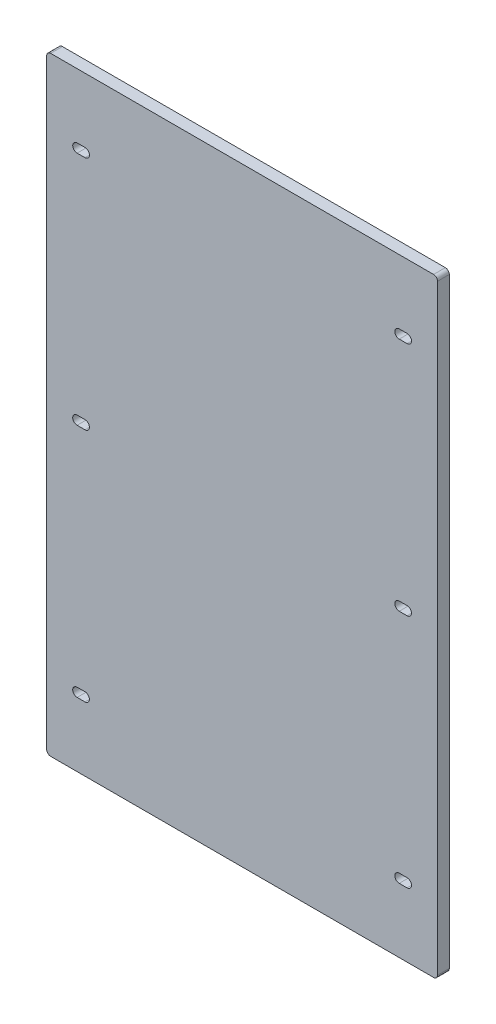
ISO-10303-21;
HEADER;
FILE_DESCRIPTION(('STEP AP214'),'2;1');
FILE_NAME('part.step','',(''),(''),'','','');
FILE_SCHEMA(('AUTOMOTIVE_DESIGN { 1 0 10303 214 1 1 1 1 }'));
ENDSEC;
DATA;
#1=APPLICATION_CONTEXT('core data for automotive mechanical design processes');
#2=APPLICATION_PROTOCOL_DEFINITION('international standard','automotive_design',2000,#1);
#3=PRODUCT_CONTEXT('',#1,'mechanical');
#4=PRODUCT('Part','Part','',(#3));
#5=PRODUCT_RELATED_PRODUCT_CATEGORY('part','',(#4));
#6=PRODUCT_DEFINITION_FORMATION('','',#4);
#7=PRODUCT_DEFINITION_CONTEXT('part definition',#1,'design');
#8=PRODUCT_DEFINITION('design','',#6,#7);
#9=PRODUCT_DEFINITION_SHAPE('','',#8);
#10=(LENGTH_UNIT() NAMED_UNIT(*) SI_UNIT(.MILLI.,.METRE.));
#11=(NAMED_UNIT(*) PLANE_ANGLE_UNIT() SI_UNIT($,.RADIAN.));
#12=(NAMED_UNIT(*) SI_UNIT($,.STERADIAN.) SOLID_ANGLE_UNIT());
#13=UNCERTAINTY_MEASURE_WITH_UNIT(LENGTH_MEASURE(1.E-05),#10,'distance_accuracy_value','');
#14=(GEOMETRIC_REPRESENTATION_CONTEXT(3) GLOBAL_UNCERTAINTY_ASSIGNED_CONTEXT((#13)) GLOBAL_UNIT_ASSIGNED_CONTEXT((#10,
#11,#12)) REPRESENTATION_CONTEXT('',''));
#15=CARTESIAN_POINT('',(0.,0.,0.));
#16=DIRECTION('',(0.,0.,1.));
#17=DIRECTION('',(1.,0.,0.));
#18=AXIS2_PLACEMENT_3D('',#15,#16,#17);
#19=CARTESIAN_POINT('',(0.,0.,-6.));
#20=DIRECTION('',(0.,0.,1.));
#21=DIRECTION('',(1.,0.,0.));
#22=AXIS2_PLACEMENT_3D('',#19,#20,#21);
#23=PLANE('',#22);
#24=CARTESIAN_POINT('',(84.,-120.,-6.));
#25=DIRECTION('',(0.,0.,1.));
#26=DIRECTION('',(1.,0.,0.));
#27=AXIS2_PLACEMENT_3D('',#24,#25,#26);
#28=CIRCLE('',#27,2.25);
#29=CARTESIAN_POINT('',(84.,-117.75,-6.));
#30=VERTEX_POINT('',#29);
#31=CARTESIAN_POINT('',(84.,-122.25,-6.));
#32=VERTEX_POINT('',#31);
#33=EDGE_CURVE('E316',#30,#32,#28,.F.);
#34=ORIENTED_EDGE('',*,*,#33,.F.);
#35=DIRECTION('',(1.,0.,0.));
#36=VECTOR('',#35,1.);
#37=CARTESIAN_POINT('',(0.,-117.75,-6.));
#38=LINE('',#37,#36);
#39=CARTESIAN_POINT('',(80.,-117.75,-6.));
#40=VERTEX_POINT('',#39);
#41=EDGE_CURVE('E303',#40,#30,#38,.T.);
#42=ORIENTED_EDGE('',*,*,#41,.F.);
#43=CARTESIAN_POINT('',(80.,-120.,-6.));
#44=DIRECTION('',(0.,0.,1.));
#45=DIRECTION('',(1.,0.,0.));
#46=AXIS2_PLACEMENT_3D('',#43,#44,#45);
#47=CIRCLE('',#46,2.25);
#48=CARTESIAN_POINT('',(80.,-122.25,-6.));
#49=VERTEX_POINT('',#48);
#50=EDGE_CURVE('E311',#49,#40,#47,.F.);
#51=ORIENTED_EDGE('',*,*,#50,.F.);
#52=DIRECTION('',(-1.,0.,0.));
#53=VECTOR('',#52,1.);
#54=CARTESIAN_POINT('',(0.,-122.25,-6.));
#55=LINE('',#54,#53);
#56=EDGE_CURVE('E314',#32,#49,#55,.T.);
#57=ORIENTED_EDGE('',*,*,#56,.F.);
#58=EDGE_LOOP('',(#34,#42,#51,#57));
#59=FACE_BOUND('',#58,.T.);
#60=DIRECTION('',(1.,0.,0.));
#61=VECTOR('',#60,1.);
#62=CARTESIAN_POINT('',(99.5,-155.,-6.));
#63=LINE('',#62,#61);
#64=CARTESIAN_POINT('',(-97.5,-155.,-6.));
#65=VERTEX_POINT('',#64);
#66=CARTESIAN_POINT('',(97.5,-155.,-6.));
#67=VERTEX_POINT('',#66);
#68=EDGE_CURVE('E448',#65,#67,#63,.T.);
#69=ORIENTED_EDGE('',*,*,#68,.F.);
#70=CARTESIAN_POINT('',(-97.5,-153.,-6.));
#71=DIRECTION('',(0.,0.,1.));
#72=DIRECTION('',(1.,0.,0.));
#73=AXIS2_PLACEMENT_3D('',#70,#71,#72);
#74=CIRCLE('',#73,2.);
#75=CARTESIAN_POINT('',(-99.5,-153.,-6.));
#76=VERTEX_POINT('',#75);
#77=EDGE_CURVE('E490',#65,#76,#74,.F.);
#78=ORIENTED_EDGE('',*,*,#77,.T.);
#79=DIRECTION('',(0.,-1.,0.));
#80=VECTOR('',#79,1.);
#81=CARTESIAN_POINT('',(-99.5,-155.,-6.));
#82=LINE('',#81,#80);
#83=CARTESIAN_POINT('',(-99.5,153.,-6.));
#84=VERTEX_POINT('',#83);
#85=EDGE_CURVE('E445',#84,#76,#82,.T.);
#86=ORIENTED_EDGE('',*,*,#85,.F.);
#87=CARTESIAN_POINT('',(-97.5,153.,-6.));
#88=DIRECTION('',(0.,0.,1.));
#89=DIRECTION('',(1.,0.,0.));
#90=AXIS2_PLACEMENT_3D('',#87,#88,#89);
#91=CIRCLE('',#90,2.);
#92=CARTESIAN_POINT('',(-97.5,155.,-6.));
#93=VERTEX_POINT('',#92);
#94=EDGE_CURVE('E485',#84,#93,#91,.F.);
#95=ORIENTED_EDGE('',*,*,#94,.T.);
#96=DIRECTION('',(-1.,0.,0.));
#97=VECTOR('',#96,1.);
#98=CARTESIAN_POINT('',(99.5,155.,-6.));
#99=LINE('',#98,#97);
#100=CARTESIAN_POINT('',(97.5,155.,-6.));
#101=VERTEX_POINT('',#100);
#102=EDGE_CURVE('E454',#101,#93,#99,.T.);
#103=ORIENTED_EDGE('',*,*,#102,.F.);
#104=CARTESIAN_POINT('',(97.5,153.,-6.));
#105=DIRECTION('',(0.,0.,1.));
#106=DIRECTION('',(1.,0.,0.));
#107=AXIS2_PLACEMENT_3D('',#104,#105,#106);
#108=CIRCLE('',#107,2.);
#109=CARTESIAN_POINT('',(99.5,153.,-6.));
#110=VERTEX_POINT('',#109);
#111=EDGE_CURVE('E52',#101,#110,#108,.F.);
#112=ORIENTED_EDGE('',*,*,#111,.T.);
#113=DIRECTION('',(0.,1.,0.));
#114=VECTOR('',#113,1.);
#115=CARTESIAN_POINT('',(99.5,-155.,-6.));
#116=LINE('',#115,#114);
#117=CARTESIAN_POINT('',(99.5,-153.,-6.));
#118=VERTEX_POINT('',#117);
#119=EDGE_CURVE('E452',#118,#110,#116,.T.);
#120=ORIENTED_EDGE('',*,*,#119,.F.);
#121=CARTESIAN_POINT('',(97.5,-153.,-6.));
#122=DIRECTION('',(0.,0.,1.));
#123=DIRECTION('',(1.,0.,0.));
#124=AXIS2_PLACEMENT_3D('',#121,#122,#123);
#125=CIRCLE('',#124,2.);
#126=EDGE_CURVE('E488',#118,#67,#125,.F.);
#127=ORIENTED_EDGE('',*,*,#126,.T.);
#128=EDGE_LOOP('',(#69,#78,#86,#95,#103,#112,#120,#127));
#129=FACE_BOUND('',#128,.T.);
#130=DIRECTION('',(-1.,0.,0.));
#131=VECTOR('',#130,1.);
#132=CARTESIAN_POINT('',(0.,2.25,-6.));
#133=LINE('',#132,#131);
#134=CARTESIAN_POINT('',(-80.,2.25,-6.));
#135=VERTEX_POINT('',#134);
#136=CARTESIAN_POINT('',(-84.,2.25,-6.));
#137=VERTEX_POINT('',#136);
#138=EDGE_CURVE('E438',#135,#137,#133,.T.);
#139=ORIENTED_EDGE('',*,*,#138,.T.);
#140=CARTESIAN_POINT('',(-84.,0.,-6.));
#141=DIRECTION('',(0.,0.,1.));
#142=DIRECTION('',(1.,0.,0.));
#143=AXIS2_PLACEMENT_3D('',#140,#141,#142);
#144=CIRCLE('',#143,2.25);
#145=CARTESIAN_POINT('',(-84.,-2.25,-6.));
#146=VERTEX_POINT('',#145);
#147=EDGE_CURVE('E441',#137,#146,#144,.T.);
#148=ORIENTED_EDGE('',*,*,#147,.T.);
#149=DIRECTION('',(1.,0.,0.));
#150=VECTOR('',#149,1.);
#151=CARTESIAN_POINT('',(0.,-2.25,-6.));
#152=LINE('',#151,#150);
#153=CARTESIAN_POINT('',(-80.,-2.25,-6.));
#154=VERTEX_POINT('',#153);
#155=EDGE_CURVE('E426',#146,#154,#152,.T.);
#156=ORIENTED_EDGE('',*,*,#155,.T.);
#157=CARTESIAN_POINT('',(-80.,0.,-6.));
#158=DIRECTION('',(0.,0.,1.));
#159=DIRECTION('',(1.,0.,0.));
#160=AXIS2_PLACEMENT_3D('',#157,#158,#159);
#161=CIRCLE('',#160,2.25);
#162=EDGE_CURVE('E435',#154,#135,#161,.T.);
#163=ORIENTED_EDGE('',*,*,#162,.T.);
#164=EDGE_LOOP('',(#139,#148,#156,#163));
#165=FACE_BOUND('',#164,.T.);
#166=DIRECTION('',(-1.,0.,0.));
#167=VECTOR('',#166,1.);
#168=CARTESIAN_POINT('',(0.,-117.75,-6.));
#169=LINE('',#168,#167);
#170=CARTESIAN_POINT('',(-80.,-117.75,-6.));
#171=VERTEX_POINT('',#170);
#172=CARTESIAN_POINT('',(-84.,-117.75,-6.));
#173=VERTEX_POINT('',#172);
#174=EDGE_CURVE('E406',#171,#173,#169,.T.);
#175=ORIENTED_EDGE('',*,*,#174,.T.);
#176=CARTESIAN_POINT('',(-84.,-120.,-6.));
#177=DIRECTION('',(0.,0.,1.));
#178=DIRECTION('',(1.,0.,0.));
#179=AXIS2_PLACEMENT_3D('',#176,#177,#178);
#180=CIRCLE('',#179,2.25);
#181=CARTESIAN_POINT('',(-84.,-122.25,-6.));
#182=VERTEX_POINT('',#181);
#183=EDGE_CURVE('E409',#173,#182,#180,.T.);
#184=ORIENTED_EDGE('',*,*,#183,.T.);
#185=DIRECTION('',(1.,0.,0.));
#186=VECTOR('',#185,1.);
#187=CARTESIAN_POINT('',(0.,-122.25,-6.));
#188=LINE('',#187,#186);
#189=CARTESIAN_POINT('',(-80.,-122.25,-6.));
#190=VERTEX_POINT('',#189);
#191=EDGE_CURVE('E394',#182,#190,#188,.T.);
#192=ORIENTED_EDGE('',*,*,#191,.T.);
#193=CARTESIAN_POINT('',(-80.,-120.,-6.));
#194=DIRECTION('',(0.,0.,1.));
#195=DIRECTION('',(1.,0.,0.));
#196=AXIS2_PLACEMENT_3D('',#193,#194,#195);
#197=CIRCLE('',#196,2.25);
#198=EDGE_CURVE('E403',#190,#171,#197,.T.);
#199=ORIENTED_EDGE('',*,*,#198,.T.);
#200=EDGE_LOOP('',(#175,#184,#192,#199));
#201=FACE_BOUND('',#200,.T.);
#202=DIRECTION('',(-1.,0.,0.));
#203=VECTOR('',#202,1.);
#204=CARTESIAN_POINT('',(0.,122.25,-6.));
#205=LINE('',#204,#203);
#206=CARTESIAN_POINT('',(-80.,122.25,-6.));
#207=VERTEX_POINT('',#206);
#208=CARTESIAN_POINT('',(-84.,122.25,-6.));
#209=VERTEX_POINT('',#208);
#210=EDGE_CURVE('E374',#207,#209,#205,.T.);
#211=ORIENTED_EDGE('',*,*,#210,.T.);
#212=CARTESIAN_POINT('',(-84.,120.,-6.));
#213=DIRECTION('',(0.,0.,1.));
#214=DIRECTION('',(1.,0.,0.));
#215=AXIS2_PLACEMENT_3D('',#212,#213,#214);
#216=CIRCLE('',#215,2.25);
#217=CARTESIAN_POINT('',(-84.,117.75,-6.));
#218=VERTEX_POINT('',#217);
#219=EDGE_CURVE('E377',#209,#218,#216,.T.);
#220=ORIENTED_EDGE('',*,*,#219,.T.);
#221=DIRECTION('',(1.,0.,0.));
#222=VECTOR('',#221,1.);
#223=CARTESIAN_POINT('',(0.,117.75,-6.));
#224=LINE('',#223,#222);
#225=CARTESIAN_POINT('',(-80.,117.75,-6.));
#226=VERTEX_POINT('',#225);
#227=EDGE_CURVE('E362',#218,#226,#224,.T.);
#228=ORIENTED_EDGE('',*,*,#227,.T.);
#229=CARTESIAN_POINT('',(-80.,120.,-6.));
#230=DIRECTION('',(0.,0.,1.));
#231=DIRECTION('',(1.,0.,0.));
#232=AXIS2_PLACEMENT_3D('',#229,#230,#231);
#233=CIRCLE('',#232,2.25);
#234=EDGE_CURVE('E371',#226,#207,#233,.T.);
#235=ORIENTED_EDGE('',*,*,#234,.T.);
#236=EDGE_LOOP('',(#211,#220,#228,#235));
#237=FACE_BOUND('',#236,.T.);
#238=CARTESIAN_POINT('',(84.,0.,-6.));
#239=DIRECTION('',(0.,0.,1.));
#240=DIRECTION('',(1.,0.,0.));
#241=AXIS2_PLACEMENT_3D('',#238,#239,#240);
#242=CIRCLE('',#241,2.25);
#243=CARTESIAN_POINT('',(84.,2.25,-6.));
#244=VERTEX_POINT('',#243);
#245=CARTESIAN_POINT('',(84.,-2.25,-6.));
#246=VERTEX_POINT('',#245);
#247=EDGE_CURVE('E346',#244,#246,#242,.F.);
#248=ORIENTED_EDGE('',*,*,#247,.F.);
#249=DIRECTION('',(1.,0.,0.));
#250=VECTOR('',#249,1.);
#251=CARTESIAN_POINT('',(0.,2.25,-6.));
#252=LINE('',#251,#250);
#253=CARTESIAN_POINT('',(80.,2.25,-6.));
#254=VERTEX_POINT('',#253);
#255=EDGE_CURVE('E333',#254,#244,#252,.T.);
#256=ORIENTED_EDGE('',*,*,#255,.F.);
#257=CARTESIAN_POINT('',(80.,0.,-6.));
#258=DIRECTION('',(0.,0.,1.));
#259=DIRECTION('',(1.,0.,0.));
#260=AXIS2_PLACEMENT_3D('',#257,#258,#259);
#261=CIRCLE('',#260,2.25);
#262=CARTESIAN_POINT('',(80.,-2.25,-6.));
#263=VERTEX_POINT('',#262);
#264=EDGE_CURVE('E341',#263,#254,#261,.F.);
#265=ORIENTED_EDGE('',*,*,#264,.F.);
#266=DIRECTION('',(-1.,0.,0.));
#267=VECTOR('',#266,1.);
#268=CARTESIAN_POINT('',(0.,-2.25,-6.));
#269=LINE('',#268,#267);
#270=EDGE_CURVE('E344',#246,#263,#269,.T.);
#271=ORIENTED_EDGE('',*,*,#270,.F.);
#272=EDGE_LOOP('',(#248,#256,#265,#271));
#273=FACE_BOUND('',#272,.T.);
#274=CARTESIAN_POINT('',(84.,120.,-6.));
#275=DIRECTION('',(0.,0.,1.));
#276=DIRECTION('',(1.,0.,0.));
#277=AXIS2_PLACEMENT_3D('',#274,#275,#276);
#278=CIRCLE('',#277,2.25);
#279=CARTESIAN_POINT('',(84.,122.25,-6.));
#280=VERTEX_POINT('',#279);
#281=CARTESIAN_POINT('',(84.,117.75,-6.));
#282=VERTEX_POINT('',#281);
#283=EDGE_CURVE('E286',#280,#282,#278,.F.);
#284=ORIENTED_EDGE('',*,*,#283,.F.);
#285=DIRECTION('',(1.,0.,0.));
#286=VECTOR('',#285,1.);
#287=CARTESIAN_POINT('',(0.,122.25,-6.));
#288=LINE('',#287,#286);
#289=CARTESIAN_POINT('',(80.,122.25,-6.));
#290=VERTEX_POINT('',#289);
#291=EDGE_CURVE('E279',#290,#280,#288,.T.);
#292=ORIENTED_EDGE('',*,*,#291,.F.);
#293=CARTESIAN_POINT('',(80.,120.,-6.));
#294=DIRECTION('',(0.,0.,1.));
#295=DIRECTION('',(1.,0.,0.));
#296=AXIS2_PLACEMENT_3D('',#293,#294,#295);
#297=CIRCLE('',#296,2.25);
#298=CARTESIAN_POINT('',(80.,117.75,-6.));
#299=VERTEX_POINT('',#298);
#300=EDGE_CURVE('E255',#299,#290,#297,.F.);
#301=ORIENTED_EDGE('',*,*,#300,.F.);
#302=DIRECTION('',(-1.,0.,0.));
#303=VECTOR('',#302,1.);
#304=CARTESIAN_POINT('',(0.,117.75,-6.));
#305=LINE('',#304,#303);
#306=EDGE_CURVE('E284',#282,#299,#305,.T.);
#307=ORIENTED_EDGE('',*,*,#306,.F.);
#308=EDGE_LOOP('',(#284,#292,#301,#307));
#309=FACE_BOUND('',#308,.T.);
#310=ADVANCED_FACE('F37',(#59,#129,#165,#201,#237,#273,#309),#23,.F.);
#311=CARTESIAN_POINT('',(0.,0.,0.));
#312=DIRECTION('',(0.,0.,1.));
#313=DIRECTION('',(1.,0.,0.));
#314=AXIS2_PLACEMENT_3D('',#311,#312,#313);
#315=PLANE('',#314);
#316=DIRECTION('',(1.,0.,0.));
#317=VECTOR('',#316,1.);
#318=CARTESIAN_POINT('',(84.,-117.75,0.));
#319=LINE('',#318,#317);
#320=CARTESIAN_POINT('',(80.,-117.75,0.));
#321=VERTEX_POINT('',#320);
#322=CARTESIAN_POINT('',(84.,-117.75,0.));
#323=VERTEX_POINT('',#322);
#324=EDGE_CURVE('E291',#321,#323,#319,.T.);
#325=ORIENTED_EDGE('',*,*,#324,.T.);
#326=CARTESIAN_POINT('',(84.,-120.,0.));
#327=DIRECTION('',(0.,0.,-1.));
#328=DIRECTION('',(-1.,0.,0.));
#329=AXIS2_PLACEMENT_3D('',#326,#327,#328);
#330=CIRCLE('',#329,2.25);
#331=CARTESIAN_POINT('',(84.,-122.25,0.));
#332=VERTEX_POINT('',#331);
#333=EDGE_CURVE('E288',#323,#332,#330,.T.);
#334=ORIENTED_EDGE('',*,*,#333,.T.);
#335=DIRECTION('',(-1.,0.,0.));
#336=VECTOR('',#335,1.);
#337=CARTESIAN_POINT('',(84.,-122.25,0.));
#338=LINE('',#337,#336);
#339=CARTESIAN_POINT('',(80.,-122.25,0.));
#340=VERTEX_POINT('',#339);
#341=EDGE_CURVE('E297',#332,#340,#338,.T.);
#342=ORIENTED_EDGE('',*,*,#341,.T.);
#343=CARTESIAN_POINT('',(80.,-120.,0.));
#344=DIRECTION('',(0.,0.,-1.));
#345=DIRECTION('',(-1.,0.,0.));
#346=AXIS2_PLACEMENT_3D('',#343,#344,#345);
#347=CIRCLE('',#346,2.25);
#348=EDGE_CURVE('E294',#340,#321,#347,.T.);
#349=ORIENTED_EDGE('',*,*,#348,.T.);
#350=EDGE_LOOP('',(#325,#334,#342,#349));
#351=FACE_BOUND('',#350,.T.);
#352=DIRECTION('',(0.,-1.,0.));
#353=VECTOR('',#352,1.);
#354=CARTESIAN_POINT('',(-99.5,-155.,0.));
#355=LINE('',#354,#353);
#356=CARTESIAN_POINT('',(-99.5,153.,0.));
#357=VERTEX_POINT('',#356);
#358=CARTESIAN_POINT('',(-99.5,-153.,0.));
#359=VERTEX_POINT('',#358);
#360=EDGE_CURVE('E444',#357,#359,#355,.T.);
#361=ORIENTED_EDGE('',*,*,#360,.T.);
#362=CARTESIAN_POINT('',(-97.5,-153.,0.));
#363=DIRECTION('',(0.,0.,1.));
#364=DIRECTION('',(1.,0.,0.));
#365=AXIS2_PLACEMENT_3D('',#362,#363,#364);
#366=CIRCLE('',#365,2.);
#367=CARTESIAN_POINT('',(-97.5,-155.,0.));
#368=VERTEX_POINT('',#367);
#369=EDGE_CURVE('E478',#359,#368,#366,.T.);
#370=ORIENTED_EDGE('',*,*,#369,.T.);
#371=DIRECTION('',(1.,0.,0.));
#372=VECTOR('',#371,1.);
#373=CARTESIAN_POINT('',(99.5,-155.,0.));
#374=LINE('',#373,#372);
#375=CARTESIAN_POINT('',(97.5,-155.,0.));
#376=VERTEX_POINT('',#375);
#377=EDGE_CURVE('E460',#368,#376,#374,.T.);
#378=ORIENTED_EDGE('',*,*,#377,.T.);
#379=CARTESIAN_POINT('',(97.5,-153.,0.));
#380=DIRECTION('',(0.,0.,1.));
#381=DIRECTION('',(1.,0.,0.));
#382=AXIS2_PLACEMENT_3D('',#379,#380,#381);
#383=CIRCLE('',#382,2.);
#384=CARTESIAN_POINT('',(99.5,-153.,0.));
#385=VERTEX_POINT('',#384);
#386=EDGE_CURVE('E476',#376,#385,#383,.T.);
#387=ORIENTED_EDGE('',*,*,#386,.T.);
#388=DIRECTION('',(0.,1.,0.));
#389=VECTOR('',#388,1.);
#390=CARTESIAN_POINT('',(99.5,-155.,0.));
#391=LINE('',#390,#389);
#392=CARTESIAN_POINT('',(99.5,153.,0.));
#393=VERTEX_POINT('',#392);
#394=EDGE_CURVE('E463',#385,#393,#391,.T.);
#395=ORIENTED_EDGE('',*,*,#394,.T.);
#396=CARTESIAN_POINT('',(97.5,153.,0.));
#397=DIRECTION('',(0.,0.,1.));
#398=DIRECTION('',(1.,0.,0.));
#399=AXIS2_PLACEMENT_3D('',#396,#397,#398);
#400=CIRCLE('',#399,2.);
#401=CARTESIAN_POINT('',(97.5,155.,0.));
#402=VERTEX_POINT('',#401);
#403=EDGE_CURVE('E474',#393,#402,#400,.T.);
#404=ORIENTED_EDGE('',*,*,#403,.T.);
#405=DIRECTION('',(-1.,0.,0.));
#406=VECTOR('',#405,1.);
#407=CARTESIAN_POINT('',(99.5,155.,0.));
#408=LINE('',#407,#406);
#409=CARTESIAN_POINT('',(-97.5,155.,0.));
#410=VERTEX_POINT('',#409);
#411=EDGE_CURVE('E449',#402,#410,#408,.T.);
#412=ORIENTED_EDGE('',*,*,#411,.T.);
#413=CARTESIAN_POINT('',(-97.5,153.,0.));
#414=DIRECTION('',(0.,0.,1.));
#415=DIRECTION('',(1.,0.,0.));
#416=AXIS2_PLACEMENT_3D('',#413,#414,#415);
#417=CIRCLE('',#416,2.);
#418=EDGE_CURVE('E472',#410,#357,#417,.T.);
#419=ORIENTED_EDGE('',*,*,#418,.T.);
#420=EDGE_LOOP('',(#361,#370,#378,#387,#395,#404,#412,#419));
#421=FACE_BOUND('',#420,.T.);
#422=CARTESIAN_POINT('',(-84.,0.,0.));
#423=DIRECTION('',(0.,0.,1.));
#424=DIRECTION('',(1.,0.,0.));
#425=AXIS2_PLACEMENT_3D('',#422,#423,#424);
#426=CIRCLE('',#425,2.25);
#427=CARTESIAN_POINT('',(-84.,2.25,0.));
#428=VERTEX_POINT('',#427);
#429=CARTESIAN_POINT('',(-84.,-2.25,0.));
#430=VERTEX_POINT('',#429);
#431=EDGE_CURVE('E412',#428,#430,#426,.T.);
#432=ORIENTED_EDGE('',*,*,#431,.F.);
#433=DIRECTION('',(-1.,0.,0.));
#434=VECTOR('',#433,1.);
#435=CARTESIAN_POINT('',(-84.,2.25,0.));
#436=LINE('',#435,#434);
#437=CARTESIAN_POINT('',(-80.,2.25,0.));
#438=VERTEX_POINT('',#437);
#439=EDGE_CURVE('E420',#438,#428,#436,.T.);
#440=ORIENTED_EDGE('',*,*,#439,.F.);
#441=CARTESIAN_POINT('',(-80.,0.,0.));
#442=DIRECTION('',(0.,0.,1.));
#443=DIRECTION('',(1.,0.,0.));
#444=AXIS2_PLACEMENT_3D('',#441,#442,#443);
#445=CIRCLE('',#444,2.25);
#446=CARTESIAN_POINT('',(-80.,-2.25,0.));
#447=VERTEX_POINT('',#446);
#448=EDGE_CURVE('E417',#447,#438,#445,.T.);
#449=ORIENTED_EDGE('',*,*,#448,.F.);
#450=DIRECTION('',(1.,0.,0.));
#451=VECTOR('',#450,1.);
#452=CARTESIAN_POINT('',(-84.,-2.25,0.));
#453=LINE('',#452,#451);
#454=EDGE_CURVE('E414',#430,#447,#453,.T.);
#455=ORIENTED_EDGE('',*,*,#454,.F.);
#456=EDGE_LOOP('',(#432,#440,#449,#455));
#457=FACE_BOUND('',#456,.T.);
#458=CARTESIAN_POINT('',(-84.,-120.,0.));
#459=DIRECTION('',(0.,0.,1.));
#460=DIRECTION('',(1.,0.,0.));
#461=AXIS2_PLACEMENT_3D('',#458,#459,#460);
#462=CIRCLE('',#461,2.25);
#463=CARTESIAN_POINT('',(-84.,-117.75,0.));
#464=VERTEX_POINT('',#463);
#465=CARTESIAN_POINT('',(-84.,-122.25,0.));
#466=VERTEX_POINT('',#465);
#467=EDGE_CURVE('E380',#464,#466,#462,.T.);
#468=ORIENTED_EDGE('',*,*,#467,.F.);
#469=DIRECTION('',(-1.,0.,0.));
#470=VECTOR('',#469,1.);
#471=CARTESIAN_POINT('',(-84.,-117.75,0.));
#472=LINE('',#471,#470);
#473=CARTESIAN_POINT('',(-80.,-117.75,0.));
#474=VERTEX_POINT('',#473);
#475=EDGE_CURVE('E388',#474,#464,#472,.T.);
#476=ORIENTED_EDGE('',*,*,#475,.F.);
#477=CARTESIAN_POINT('',(-80.,-120.,0.));
#478=DIRECTION('',(0.,0.,1.));
#479=DIRECTION('',(1.,0.,0.));
#480=AXIS2_PLACEMENT_3D('',#477,#478,#479);
#481=CIRCLE('',#480,2.25);
#482=CARTESIAN_POINT('',(-80.,-122.25,0.));
#483=VERTEX_POINT('',#482);
#484=EDGE_CURVE('E385',#483,#474,#481,.T.);
#485=ORIENTED_EDGE('',*,*,#484,.F.);
#486=DIRECTION('',(1.,0.,0.));
#487=VECTOR('',#486,1.);
#488=CARTESIAN_POINT('',(-84.,-122.25,0.));
#489=LINE('',#488,#487);
#490=EDGE_CURVE('E382',#466,#483,#489,.T.);
#491=ORIENTED_EDGE('',*,*,#490,.F.);
#492=EDGE_LOOP('',(#468,#476,#485,#491));
#493=FACE_BOUND('',#492,.T.);
#494=CARTESIAN_POINT('',(-84.,120.,0.));
#495=DIRECTION('',(0.,0.,1.));
#496=DIRECTION('',(1.,0.,0.));
#497=AXIS2_PLACEMENT_3D('',#494,#495,#496);
#498=CIRCLE('',#497,2.25);
#499=CARTESIAN_POINT('',(-84.,122.25,0.));
#500=VERTEX_POINT('',#499);
#501=CARTESIAN_POINT('',(-84.,117.75,0.));
#502=VERTEX_POINT('',#501);
#503=EDGE_CURVE('E348',#500,#502,#498,.T.);
#504=ORIENTED_EDGE('',*,*,#503,.F.);
#505=DIRECTION('',(-1.,0.,0.));
#506=VECTOR('',#505,1.);
#507=CARTESIAN_POINT('',(-84.,122.25,0.));
#508=LINE('',#507,#506);
#509=CARTESIAN_POINT('',(-80.,122.25,0.));
#510=VERTEX_POINT('',#509);
#511=EDGE_CURVE('E356',#510,#500,#508,.T.);
#512=ORIENTED_EDGE('',*,*,#511,.F.);
#513=CARTESIAN_POINT('',(-80.,120.,0.));
#514=DIRECTION('',(0.,0.,1.));
#515=DIRECTION('',(1.,0.,0.));
#516=AXIS2_PLACEMENT_3D('',#513,#514,#515);
#517=CIRCLE('',#516,2.25);
#518=CARTESIAN_POINT('',(-80.,117.75,0.));
#519=VERTEX_POINT('',#518);
#520=EDGE_CURVE('E353',#519,#510,#517,.T.);
#521=ORIENTED_EDGE('',*,*,#520,.F.);
#522=DIRECTION('',(1.,0.,0.));
#523=VECTOR('',#522,1.);
#524=CARTESIAN_POINT('',(-84.,117.75,0.));
#525=LINE('',#524,#523);
#526=EDGE_CURVE('E350',#502,#519,#525,.T.);
#527=ORIENTED_EDGE('',*,*,#526,.F.);
#528=EDGE_LOOP('',(#504,#512,#521,#527));
#529=FACE_BOUND('',#528,.T.);
#530=DIRECTION('',(1.,0.,0.));
#531=VECTOR('',#530,1.);
#532=CARTESIAN_POINT('',(84.,2.25,0.));
#533=LINE('',#532,#531);
#534=CARTESIAN_POINT('',(80.,2.25,0.));
#535=VERTEX_POINT('',#534);
#536=CARTESIAN_POINT('',(84.,2.25,0.));
#537=VERTEX_POINT('',#536);
#538=EDGE_CURVE('E321',#535,#537,#533,.T.);
#539=ORIENTED_EDGE('',*,*,#538,.T.);
#540=CARTESIAN_POINT('',(84.,0.,0.));
#541=DIRECTION('',(0.,0.,-1.));
#542=DIRECTION('',(-1.,0.,0.));
#543=AXIS2_PLACEMENT_3D('',#540,#541,#542);
#544=CIRCLE('',#543,2.25);
#545=CARTESIAN_POINT('',(84.,-2.25,0.));
#546=VERTEX_POINT('',#545);
#547=EDGE_CURVE('E318',#537,#546,#544,.T.);
#548=ORIENTED_EDGE('',*,*,#547,.T.);
#549=DIRECTION('',(-1.,0.,0.));
#550=VECTOR('',#549,1.);
#551=CARTESIAN_POINT('',(84.,-2.25,0.));
#552=LINE('',#551,#550);
#553=CARTESIAN_POINT('',(80.,-2.25,0.));
#554=VERTEX_POINT('',#553);
#555=EDGE_CURVE('E327',#546,#554,#552,.T.);
#556=ORIENTED_EDGE('',*,*,#555,.T.);
#557=CARTESIAN_POINT('',(80.,0.,0.));
#558=DIRECTION('',(0.,0.,-1.));
#559=DIRECTION('',(-1.,0.,0.));
#560=AXIS2_PLACEMENT_3D('',#557,#558,#559);
#561=CIRCLE('',#560,2.25);
#562=EDGE_CURVE('E324',#554,#535,#561,.T.);
#563=ORIENTED_EDGE('',*,*,#562,.T.);
#564=EDGE_LOOP('',(#539,#548,#556,#563));
#565=FACE_BOUND('',#564,.T.);
#566=DIRECTION('',(1.,0.,0.));
#567=VECTOR('',#566,1.);
#568=CARTESIAN_POINT('',(84.,122.25,0.));
#569=LINE('',#568,#567);
#570=CARTESIAN_POINT('',(80.,122.25,0.));
#571=VERTEX_POINT('',#570);
#572=CARTESIAN_POINT('',(84.,122.25,0.));
#573=VERTEX_POINT('',#572);
#574=EDGE_CURVE('E263',#571,#573,#569,.T.);
#575=ORIENTED_EDGE('',*,*,#574,.T.);
#576=CARTESIAN_POINT('',(84.,120.,0.));
#577=DIRECTION('',(0.,0.,-1.));
#578=DIRECTION('',(-1.,0.,0.));
#579=AXIS2_PLACEMENT_3D('',#576,#577,#578);
#580=CIRCLE('',#579,2.25);
#581=CARTESIAN_POINT('',(84.,117.75,0.));
#582=VERTEX_POINT('',#581);
#583=EDGE_CURVE('E268',#573,#582,#580,.T.);
#584=ORIENTED_EDGE('',*,*,#583,.T.);
#585=DIRECTION('',(-1.,0.,0.));
#586=VECTOR('',#585,1.);
#587=CARTESIAN_POINT('',(84.,117.75,0.));
#588=LINE('',#587,#586);
#589=CARTESIAN_POINT('',(80.,117.75,0.));
#590=VERTEX_POINT('',#589);
#591=EDGE_CURVE('E272',#582,#590,#588,.T.);
#592=ORIENTED_EDGE('',*,*,#591,.T.);
#593=CARTESIAN_POINT('',(80.,120.,0.));
#594=DIRECTION('',(0.,0.,-1.));
#595=DIRECTION('',(-1.,0.,0.));
#596=AXIS2_PLACEMENT_3D('',#593,#594,#595);
#597=CIRCLE('',#596,2.25);
#598=EDGE_CURVE('E252',#590,#571,#597,.T.);
#599=ORIENTED_EDGE('',*,*,#598,.T.);
#600=EDGE_LOOP('',(#575,#584,#592,#599));
#601=FACE_BOUND('',#600,.T.);
#602=ADVANCED_FACE('F270',(#351,#421,#457,#493,#529,#565,#601),#315,.T.);
#603=CARTESIAN_POINT('',(-99.5,-155.,-6.));
#604=DIRECTION('',(-1.,0.,0.));
#605=DIRECTION('',(0.,0.,1.));
#606=AXIS2_PLACEMENT_3D('',#603,#604,#605);
#607=PLANE('',#606);
#608=ORIENTED_EDGE('',*,*,#85,.T.);
#609=DIRECTION('',(0.,0.,1.));
#610=VECTOR('',#609,1.);
#611=CARTESIAN_POINT('',(-99.5,-153.,-6.));
#612=LINE('',#611,#610);
#613=EDGE_CURVE('E469',#76,#359,#612,.T.);
#614=ORIENTED_EDGE('',*,*,#613,.T.);
#615=ORIENTED_EDGE('',*,*,#360,.F.);
#616=DIRECTION('',(0.,0.,1.));
#617=VECTOR('',#616,1.);
#618=CARTESIAN_POINT('',(-99.5,153.,-6.));
#619=LINE('',#618,#617);
#620=EDGE_CURVE('E457',#357,#84,#619,.F.);
#621=ORIENTED_EDGE('',*,*,#620,.T.);
#622=EDGE_LOOP('',(#608,#614,#615,#621));
#623=FACE_BOUND('',#622,.T.);
#624=ADVANCED_FACE('F525',(#623),#607,.T.);
#625=CARTESIAN_POINT('',(99.5,155.,-6.));
#626=DIRECTION('',(0.,1.,0.));
#627=DIRECTION('',(0.,0.,1.));
#628=AXIS2_PLACEMENT_3D('',#625,#626,#627);
#629=PLANE('',#628);
#630=ORIENTED_EDGE('',*,*,#411,.F.);
#631=DIRECTION('',(0.,0.,1.));
#632=VECTOR('',#631,1.);
#633=CARTESIAN_POINT('',(97.5,155.,-6.));
#634=LINE('',#633,#632);
#635=EDGE_CURVE('E11',#402,#101,#634,.F.);
#636=ORIENTED_EDGE('',*,*,#635,.T.);
#637=ORIENTED_EDGE('',*,*,#102,.T.);
#638=DIRECTION('',(0.,0.,1.));
#639=VECTOR('',#638,1.);
#640=CARTESIAN_POINT('',(-97.5,155.,-6.));
#641=LINE('',#640,#639);
#642=EDGE_CURVE('E45',#93,#410,#641,.T.);
#643=ORIENTED_EDGE('',*,*,#642,.T.);
#644=EDGE_LOOP('',(#630,#636,#637,#643));
#645=FACE_BOUND('',#644,.T.);
#646=ADVANCED_FACE('F499',(#645),#629,.T.);
#647=CARTESIAN_POINT('',(99.5,-155.,-6.));
#648=DIRECTION('',(1.,0.,0.));
#649=DIRECTION('',(0.,0.,-1.));
#650=AXIS2_PLACEMENT_3D('',#647,#648,#649);
#651=PLANE('',#650);
#652=ORIENTED_EDGE('',*,*,#394,.F.);
#653=DIRECTION('',(0.,0.,1.));
#654=VECTOR('',#653,1.);
#655=CARTESIAN_POINT('',(99.5,-153.,-6.));
#656=LINE('',#655,#654);
#657=EDGE_CURVE('E59',#385,#118,#656,.F.);
#658=ORIENTED_EDGE('',*,*,#657,.T.);
#659=ORIENTED_EDGE('',*,*,#119,.T.);
#660=DIRECTION('',(0.,0.,1.));
#661=VECTOR('',#660,1.);
#662=CARTESIAN_POINT('',(99.5,153.,-6.));
#663=LINE('',#662,#661);
#664=EDGE_CURVE('E492',#110,#393,#663,.T.);
#665=ORIENTED_EDGE('',*,*,#664,.T.);
#666=EDGE_LOOP('',(#652,#658,#659,#665));
#667=FACE_BOUND('',#666,.T.);
#668=ADVANCED_FACE('F509',(#667),#651,.T.);
#669=CARTESIAN_POINT('',(99.5,-155.,-6.));
#670=DIRECTION('',(0.,-1.,0.));
#671=DIRECTION('',(0.,0.,-1.));
#672=AXIS2_PLACEMENT_3D('',#669,#670,#671);
#673=PLANE('',#672);
#674=ORIENTED_EDGE('',*,*,#377,.F.);
#675=DIRECTION('',(0.,0.,1.));
#676=VECTOR('',#675,1.);
#677=CARTESIAN_POINT('',(-97.5,-155.,-6.));
#678=LINE('',#677,#676);
#679=EDGE_CURVE('E483',#368,#65,#678,.F.);
#680=ORIENTED_EDGE('',*,*,#679,.T.);
#681=ORIENTED_EDGE('',*,*,#68,.T.);
#682=DIRECTION('',(0.,0.,1.));
#683=VECTOR('',#682,1.);
#684=CARTESIAN_POINT('',(97.5,-155.,-6.));
#685=LINE('',#684,#683);
#686=EDGE_CURVE('E480',#67,#376,#685,.T.);
#687=ORIENTED_EDGE('',*,*,#686,.T.);
#688=EDGE_LOOP('',(#674,#680,#681,#687));
#689=FACE_BOUND('',#688,.T.);
#690=ADVANCED_FACE('F518',(#689),#673,.T.);
#691=CARTESIAN_POINT('',(-84.,0.,-10.));
#692=DIRECTION('',(0.,0.,1.));
#693=DIRECTION('',(1.,0.,0.));
#694=AXIS2_PLACEMENT_3D('',#691,#692,#693);
#695=CYLINDRICAL_SURFACE('',#694,2.25);
#696=DIRECTION('',(0.,0.,1.));
#697=VECTOR('',#696,1.);
#698=CARTESIAN_POINT('',(-84.,2.25,-10.));
#699=LINE('',#698,#697);
#700=EDGE_CURVE('E424',#137,#428,#699,.T.);
#701=ORIENTED_EDGE('',*,*,#700,.T.);
#702=ORIENTED_EDGE('',*,*,#431,.T.);
#703=DIRECTION('',(0.,0.,1.));
#704=VECTOR('',#703,1.);
#705=CARTESIAN_POINT('',(-84.,-2.25,-10.));
#706=LINE('',#705,#704);
#707=EDGE_CURVE('E423',#146,#430,#706,.T.);
#708=ORIENTED_EDGE('',*,*,#707,.F.);
#709=ORIENTED_EDGE('',*,*,#147,.F.);
#710=EDGE_LOOP('',(#701,#702,#708,#709));
#711=FACE_BOUND('',#710,.T.);
#712=ADVANCED_FACE('F542',(#711),#695,.F.);
#713=CARTESIAN_POINT('',(-84.,2.25,-10.));
#714=DIRECTION('',(0.,1.,0.));
#715=DIRECTION('',(0.,0.,1.));
#716=AXIS2_PLACEMENT_3D('',#713,#714,#715);
#717=PLANE('',#716);
#718=DIRECTION('',(0.,0.,1.));
#719=VECTOR('',#718,1.);
#720=CARTESIAN_POINT('',(-80.,2.25,-10.));
#721=LINE('',#720,#719);
#722=EDGE_CURVE('E427',#135,#438,#721,.T.);
#723=ORIENTED_EDGE('',*,*,#722,.T.);
#724=ORIENTED_EDGE('',*,*,#439,.T.);
#725=ORIENTED_EDGE('',*,*,#700,.F.);
#726=ORIENTED_EDGE('',*,*,#138,.F.);
#727=EDGE_LOOP('',(#723,#724,#725,#726));
#728=FACE_BOUND('',#727,.T.);
#729=ADVANCED_FACE('F824',(#728),#717,.F.);
#730=CARTESIAN_POINT('',(-80.,0.,-10.));
#731=DIRECTION('',(0.,0.,1.));
#732=DIRECTION('',(1.,0.,0.));
#733=AXIS2_PLACEMENT_3D('',#730,#731,#732);
#734=CYLINDRICAL_SURFACE('',#733,2.25);
#735=DIRECTION('',(0.,0.,1.));
#736=VECTOR('',#735,1.);
#737=CARTESIAN_POINT('',(-80.,-2.25,-10.));
#738=LINE('',#737,#736);
#739=EDGE_CURVE('E429',#154,#447,#738,.T.);
#740=ORIENTED_EDGE('',*,*,#739,.T.);
#741=ORIENTED_EDGE('',*,*,#448,.T.);
#742=ORIENTED_EDGE('',*,*,#722,.F.);
#743=ORIENTED_EDGE('',*,*,#162,.F.);
#744=EDGE_LOOP('',(#740,#741,#742,#743));
#745=FACE_BOUND('',#744,.T.);
#746=ADVANCED_FACE('F814',(#745),#734,.F.);
#747=CARTESIAN_POINT('',(-84.,-2.25,-10.));
#748=DIRECTION('',(0.,-1.,0.));
#749=DIRECTION('',(0.,0.,-1.));
#750=AXIS2_PLACEMENT_3D('',#747,#748,#749);
#751=PLANE('',#750);
#752=ORIENTED_EDGE('',*,*,#707,.T.);
#753=ORIENTED_EDGE('',*,*,#454,.T.);
#754=ORIENTED_EDGE('',*,*,#739,.F.);
#755=ORIENTED_EDGE('',*,*,#155,.F.);
#756=EDGE_LOOP('',(#752,#753,#754,#755));
#757=FACE_BOUND('',#756,.T.);
#758=ADVANCED_FACE('F803',(#757),#751,.F.);
#759=CARTESIAN_POINT('',(-84.,-120.,-10.));
#760=DIRECTION('',(0.,0.,1.));
#761=DIRECTION('',(1.,0.,0.));
#762=AXIS2_PLACEMENT_3D('',#759,#760,#761);
#763=CYLINDRICAL_SURFACE('',#762,2.25);
#764=DIRECTION('',(0.,0.,1.));
#765=VECTOR('',#764,1.);
#766=CARTESIAN_POINT('',(-84.,-117.75,-10.));
#767=LINE('',#766,#765);
#768=EDGE_CURVE('E392',#173,#464,#767,.T.);
#769=ORIENTED_EDGE('',*,*,#768,.T.);
#770=ORIENTED_EDGE('',*,*,#467,.T.);
#771=DIRECTION('',(0.,0.,1.));
#772=VECTOR('',#771,1.);
#773=CARTESIAN_POINT('',(-84.,-122.25,-10.));
#774=LINE('',#773,#772);
#775=EDGE_CURVE('E391',#182,#466,#774,.T.);
#776=ORIENTED_EDGE('',*,*,#775,.F.);
#777=ORIENTED_EDGE('',*,*,#183,.F.);
#778=EDGE_LOOP('',(#769,#770,#776,#777));
#779=FACE_BOUND('',#778,.T.);
#780=ADVANCED_FACE('F792',(#779),#763,.F.);
#781=CARTESIAN_POINT('',(-84.,-117.75,-10.));
#782=DIRECTION('',(0.,1.,0.));
#783=DIRECTION('',(0.,0.,1.));
#784=AXIS2_PLACEMENT_3D('',#781,#782,#783);
#785=PLANE('',#784);
#786=DIRECTION('',(0.,0.,1.));
#787=VECTOR('',#786,1.);
#788=CARTESIAN_POINT('',(-80.,-117.75,-10.));
#789=LINE('',#788,#787);
#790=EDGE_CURVE('E395',#171,#474,#789,.T.);
#791=ORIENTED_EDGE('',*,*,#790,.T.);
#792=ORIENTED_EDGE('',*,*,#475,.T.);
#793=ORIENTED_EDGE('',*,*,#768,.F.);
#794=ORIENTED_EDGE('',*,*,#174,.F.);
#795=EDGE_LOOP('',(#791,#792,#793,#794));
#796=FACE_BOUND('',#795,.T.);
#797=ADVANCED_FACE('F781',(#796),#785,.F.);
#798=CARTESIAN_POINT('',(-80.,-120.,-10.));
#799=DIRECTION('',(0.,0.,1.));
#800=DIRECTION('',(1.,0.,0.));
#801=AXIS2_PLACEMENT_3D('',#798,#799,#800);
#802=CYLINDRICAL_SURFACE('',#801,2.25);
#803=DIRECTION('',(0.,0.,1.));
#804=VECTOR('',#803,1.);
#805=CARTESIAN_POINT('',(-80.,-122.25,-10.));
#806=LINE('',#805,#804);
#807=EDGE_CURVE('E397',#190,#483,#806,.T.);
#808=ORIENTED_EDGE('',*,*,#807,.T.);
#809=ORIENTED_EDGE('',*,*,#484,.T.);
#810=ORIENTED_EDGE('',*,*,#790,.F.);
#811=ORIENTED_EDGE('',*,*,#198,.F.);
#812=EDGE_LOOP('',(#808,#809,#810,#811));
#813=FACE_BOUND('',#812,.T.);
#814=ADVANCED_FACE('F770',(#813),#802,.F.);
#815=CARTESIAN_POINT('',(-84.,-122.25,-10.));
#816=DIRECTION('',(0.,-1.,0.));
#817=DIRECTION('',(0.,0.,-1.));
#818=AXIS2_PLACEMENT_3D('',#815,#816,#817);
#819=PLANE('',#818);
#820=ORIENTED_EDGE('',*,*,#775,.T.);
#821=ORIENTED_EDGE('',*,*,#490,.T.);
#822=ORIENTED_EDGE('',*,*,#807,.F.);
#823=ORIENTED_EDGE('',*,*,#191,.F.);
#824=EDGE_LOOP('',(#820,#821,#822,#823));
#825=FACE_BOUND('',#824,.T.);
#826=ADVANCED_FACE('F759',(#825),#819,.F.);
#827=CARTESIAN_POINT('',(-84.,120.,-10.));
#828=DIRECTION('',(0.,0.,1.));
#829=DIRECTION('',(1.,0.,0.));
#830=AXIS2_PLACEMENT_3D('',#827,#828,#829);
#831=CYLINDRICAL_SURFACE('',#830,2.25);
#832=DIRECTION('',(0.,0.,1.));
#833=VECTOR('',#832,1.);
#834=CARTESIAN_POINT('',(-84.,122.25,-10.));
#835=LINE('',#834,#833);
#836=EDGE_CURVE('E360',#209,#500,#835,.T.);
#837=ORIENTED_EDGE('',*,*,#836,.T.);
#838=ORIENTED_EDGE('',*,*,#503,.T.);
#839=DIRECTION('',(0.,0.,1.));
#840=VECTOR('',#839,1.);
#841=CARTESIAN_POINT('',(-84.,117.75,-10.));
#842=LINE('',#841,#840);
#843=EDGE_CURVE('E359',#218,#502,#842,.T.);
#844=ORIENTED_EDGE('',*,*,#843,.F.);
#845=ORIENTED_EDGE('',*,*,#219,.F.);
#846=EDGE_LOOP('',(#837,#838,#844,#845));
#847=FACE_BOUND('',#846,.T.);
#848=ADVANCED_FACE('F748',(#847),#831,.F.);
#849=CARTESIAN_POINT('',(-84.,122.25,-10.));
#850=DIRECTION('',(0.,1.,0.));
#851=DIRECTION('',(0.,0.,1.));
#852=AXIS2_PLACEMENT_3D('',#849,#850,#851);
#853=PLANE('',#852);
#854=DIRECTION('',(0.,0.,1.));
#855=VECTOR('',#854,1.);
#856=CARTESIAN_POINT('',(-80.,122.25,-10.));
#857=LINE('',#856,#855);
#858=EDGE_CURVE('E363',#207,#510,#857,.T.);
#859=ORIENTED_EDGE('',*,*,#858,.T.);
#860=ORIENTED_EDGE('',*,*,#511,.T.);
#861=ORIENTED_EDGE('',*,*,#836,.F.);
#862=ORIENTED_EDGE('',*,*,#210,.F.);
#863=EDGE_LOOP('',(#859,#860,#861,#862));
#864=FACE_BOUND('',#863,.T.);
#865=ADVANCED_FACE('F737',(#864),#853,.F.);
#866=CARTESIAN_POINT('',(-80.,120.,-10.));
#867=DIRECTION('',(0.,0.,1.));
#868=DIRECTION('',(1.,0.,0.));
#869=AXIS2_PLACEMENT_3D('',#866,#867,#868);
#870=CYLINDRICAL_SURFACE('',#869,2.25);
#871=DIRECTION('',(0.,0.,1.));
#872=VECTOR('',#871,1.);
#873=CARTESIAN_POINT('',(-80.,117.75,-10.));
#874=LINE('',#873,#872);
#875=EDGE_CURVE('E365',#226,#519,#874,.T.);
#876=ORIENTED_EDGE('',*,*,#875,.T.);
#877=ORIENTED_EDGE('',*,*,#520,.T.);
#878=ORIENTED_EDGE('',*,*,#858,.F.);
#879=ORIENTED_EDGE('',*,*,#234,.F.);
#880=EDGE_LOOP('',(#876,#877,#878,#879));
#881=FACE_BOUND('',#880,.T.);
#882=ADVANCED_FACE('F726',(#881),#870,.F.);
#883=CARTESIAN_POINT('',(-84.,117.75,-10.));
#884=DIRECTION('',(0.,-1.,0.));
#885=DIRECTION('',(0.,0.,-1.));
#886=AXIS2_PLACEMENT_3D('',#883,#884,#885);
#887=PLANE('',#886);
#888=ORIENTED_EDGE('',*,*,#843,.T.);
#889=ORIENTED_EDGE('',*,*,#526,.T.);
#890=ORIENTED_EDGE('',*,*,#875,.F.);
#891=ORIENTED_EDGE('',*,*,#227,.F.);
#892=EDGE_LOOP('',(#888,#889,#890,#891));
#893=FACE_BOUND('',#892,.T.);
#894=ADVANCED_FACE('F704',(#893),#887,.F.);
#895=CARTESIAN_POINT('',(84.,0.,-10.));
#896=DIRECTION('',(0.,0.,1.));
#897=DIRECTION('',(1.,0.,0.));
#898=AXIS2_PLACEMENT_3D('',#895,#896,#897);
#899=CYLINDRICAL_SURFACE('',#898,2.25);
#900=ORIENTED_EDGE('',*,*,#247,.T.);
#901=DIRECTION('',(0.,0.,1.));
#902=VECTOR('',#901,1.);
#903=CARTESIAN_POINT('',(84.,-2.25,-10.));
#904=LINE('',#903,#902);
#905=EDGE_CURVE('E331',#246,#546,#904,.T.);
#906=ORIENTED_EDGE('',*,*,#905,.T.);
#907=ORIENTED_EDGE('',*,*,#547,.F.);
#908=DIRECTION('',(0.,0.,1.));
#909=VECTOR('',#908,1.);
#910=CARTESIAN_POINT('',(84.,2.25,-10.));
#911=LINE('',#910,#909);
#912=EDGE_CURVE('E330',#244,#537,#911,.T.);
#913=ORIENTED_EDGE('',*,*,#912,.F.);
#914=EDGE_LOOP('',(#900,#906,#907,#913));
#915=FACE_BOUND('',#914,.T.);
#916=ADVANCED_FACE('F693',(#915),#899,.F.);
#917=CARTESIAN_POINT('',(84.,-2.25,-10.));
#918=DIRECTION('',(0.,1.,0.));
#919=DIRECTION('',(0.,0.,1.));
#920=AXIS2_PLACEMENT_3D('',#917,#918,#919);
#921=PLANE('',#920);
#922=ORIENTED_EDGE('',*,*,#270,.T.);
#923=DIRECTION('',(0.,0.,1.));
#924=VECTOR('',#923,1.);
#925=CARTESIAN_POINT('',(80.,-2.25,-10.));
#926=LINE('',#925,#924);
#927=EDGE_CURVE('E334',#263,#554,#926,.T.);
#928=ORIENTED_EDGE('',*,*,#927,.T.);
#929=ORIENTED_EDGE('',*,*,#555,.F.);
#930=ORIENTED_EDGE('',*,*,#905,.F.);
#931=EDGE_LOOP('',(#922,#928,#929,#930));
#932=FACE_BOUND('',#931,.T.);
#933=ADVANCED_FACE('F682',(#932),#921,.T.);
#934=CARTESIAN_POINT('',(80.,0.,-10.));
#935=DIRECTION('',(0.,0.,1.));
#936=DIRECTION('',(1.,0.,0.));
#937=AXIS2_PLACEMENT_3D('',#934,#935,#936);
#938=CYLINDRICAL_SURFACE('',#937,2.25);
#939=ORIENTED_EDGE('',*,*,#264,.T.);
#940=DIRECTION('',(0.,0.,1.));
#941=VECTOR('',#940,1.);
#942=CARTESIAN_POINT('',(80.,2.25,-10.));
#943=LINE('',#942,#941);
#944=EDGE_CURVE('E336',#254,#535,#943,.T.);
#945=ORIENTED_EDGE('',*,*,#944,.T.);
#946=ORIENTED_EDGE('',*,*,#562,.F.);
#947=ORIENTED_EDGE('',*,*,#927,.F.);
#948=EDGE_LOOP('',(#939,#945,#946,#947));
#949=FACE_BOUND('',#948,.T.);
#950=ADVANCED_FACE('F671',(#949),#938,.F.);
#951=CARTESIAN_POINT('',(84.,2.25,-10.));
#952=DIRECTION('',(0.,-1.,0.));
#953=DIRECTION('',(0.,0.,-1.));
#954=AXIS2_PLACEMENT_3D('',#951,#952,#953);
#955=PLANE('',#954);
#956=ORIENTED_EDGE('',*,*,#255,.T.);
#957=ORIENTED_EDGE('',*,*,#912,.T.);
#958=ORIENTED_EDGE('',*,*,#538,.F.);
#959=ORIENTED_EDGE('',*,*,#944,.F.);
#960=EDGE_LOOP('',(#956,#957,#958,#959));
#961=FACE_BOUND('',#960,.T.);
#962=ADVANCED_FACE('F660',(#961),#955,.T.);
#963=CARTESIAN_POINT('',(84.,-120.,-10.));
#964=DIRECTION('',(0.,0.,1.));
#965=DIRECTION('',(1.,0.,0.));
#966=AXIS2_PLACEMENT_3D('',#963,#964,#965);
#967=CYLINDRICAL_SURFACE('',#966,2.25);
#968=ORIENTED_EDGE('',*,*,#33,.T.);
#969=DIRECTION('',(0.,0.,1.));
#970=VECTOR('',#969,1.);
#971=CARTESIAN_POINT('',(84.,-122.25,-10.));
#972=LINE('',#971,#970);
#973=EDGE_CURVE('E301',#32,#332,#972,.T.);
#974=ORIENTED_EDGE('',*,*,#973,.T.);
#975=ORIENTED_EDGE('',*,*,#333,.F.);
#976=DIRECTION('',(0.,0.,1.));
#977=VECTOR('',#976,1.);
#978=CARTESIAN_POINT('',(84.,-117.75,-10.));
#979=LINE('',#978,#977);
#980=EDGE_CURVE('E300',#30,#323,#979,.T.);
#981=ORIENTED_EDGE('',*,*,#980,.F.);
#982=EDGE_LOOP('',(#968,#974,#975,#981));
#983=FACE_BOUND('',#982,.T.);
#984=ADVANCED_FACE('F649',(#983),#967,.F.);
#985=CARTESIAN_POINT('',(84.,-122.25,-10.));
#986=DIRECTION('',(0.,1.,0.));
#987=DIRECTION('',(0.,0.,1.));
#988=AXIS2_PLACEMENT_3D('',#985,#986,#987);
#989=PLANE('',#988);
#990=ORIENTED_EDGE('',*,*,#56,.T.);
#991=DIRECTION('',(0.,0.,1.));
#992=VECTOR('',#991,1.);
#993=CARTESIAN_POINT('',(80.,-122.25,-10.));
#994=LINE('',#993,#992);
#995=EDGE_CURVE('E304',#49,#340,#994,.T.);
#996=ORIENTED_EDGE('',*,*,#995,.T.);
#997=ORIENTED_EDGE('',*,*,#341,.F.);
#998=ORIENTED_EDGE('',*,*,#973,.F.);
#999=EDGE_LOOP('',(#990,#996,#997,#998));
#1000=FACE_BOUND('',#999,.T.);
#1001=ADVANCED_FACE('F638',(#1000),#989,.T.);
#1002=CARTESIAN_POINT('',(80.,-120.,-10.));
#1003=DIRECTION('',(0.,0.,1.));
#1004=DIRECTION('',(1.,0.,0.));
#1005=AXIS2_PLACEMENT_3D('',#1002,#1003,#1004);
#1006=CYLINDRICAL_SURFACE('',#1005,2.25);
#1007=ORIENTED_EDGE('',*,*,#50,.T.);
#1008=DIRECTION('',(0.,0.,1.));
#1009=VECTOR('',#1008,1.);
#1010=CARTESIAN_POINT('',(80.,-117.75,-10.));
#1011=LINE('',#1010,#1009);
#1012=EDGE_CURVE('E306',#40,#321,#1011,.T.);
#1013=ORIENTED_EDGE('',*,*,#1012,.T.);
#1014=ORIENTED_EDGE('',*,*,#348,.F.);
#1015=ORIENTED_EDGE('',*,*,#995,.F.);
#1016=EDGE_LOOP('',(#1007,#1013,#1014,#1015));
#1017=FACE_BOUND('',#1016,.T.);
#1018=ADVANCED_FACE('F627',(#1017),#1006,.F.);
#1019=CARTESIAN_POINT('',(84.,-117.75,-10.));
#1020=DIRECTION('',(0.,-1.,0.));
#1021=DIRECTION('',(0.,0.,-1.));
#1022=AXIS2_PLACEMENT_3D('',#1019,#1020,#1021);
#1023=PLANE('',#1022);
#1024=ORIENTED_EDGE('',*,*,#41,.T.);
#1025=ORIENTED_EDGE('',*,*,#980,.T.);
#1026=ORIENTED_EDGE('',*,*,#324,.F.);
#1027=ORIENTED_EDGE('',*,*,#1012,.F.);
#1028=EDGE_LOOP('',(#1024,#1025,#1026,#1027));
#1029=FACE_BOUND('',#1028,.T.);
#1030=ADVANCED_FACE('F616',(#1029),#1023,.T.);
#1031=CARTESIAN_POINT('',(84.,120.,-10.));
#1032=DIRECTION('',(0.,0.,1.));
#1033=DIRECTION('',(1.,0.,0.));
#1034=AXIS2_PLACEMENT_3D('',#1031,#1032,#1033);
#1035=CYLINDRICAL_SURFACE('',#1034,2.25);
#1036=ORIENTED_EDGE('',*,*,#283,.T.);
#1037=DIRECTION('',(0.,0.,1.));
#1038=VECTOR('',#1037,1.);
#1039=CARTESIAN_POINT('',(84.,117.75,-10.));
#1040=LINE('',#1039,#1038);
#1041=EDGE_CURVE('E277',#282,#582,#1040,.T.);
#1042=ORIENTED_EDGE('',*,*,#1041,.T.);
#1043=ORIENTED_EDGE('',*,*,#583,.F.);
#1044=DIRECTION('',(0.,0.,1.));
#1045=VECTOR('',#1044,1.);
#1046=CARTESIAN_POINT('',(84.,122.25,-10.));
#1047=LINE('',#1046,#1045);
#1048=EDGE_CURVE('E259',#280,#573,#1047,.T.);
#1049=ORIENTED_EDGE('',*,*,#1048,.F.);
#1050=EDGE_LOOP('',(#1036,#1042,#1043,#1049));
#1051=FACE_BOUND('',#1050,.T.);
#1052=ADVANCED_FACE('F605',(#1051),#1035,.F.);
#1053=CARTESIAN_POINT('',(84.,117.75,-10.));
#1054=DIRECTION('',(0.,1.,0.));
#1055=DIRECTION('',(0.,0.,1.));
#1056=AXIS2_PLACEMENT_3D('',#1053,#1054,#1055);
#1057=PLANE('',#1056);
#1058=ORIENTED_EDGE('',*,*,#306,.T.);
#1059=DIRECTION('',(0.,0.,1.));
#1060=VECTOR('',#1059,1.);
#1061=CARTESIAN_POINT('',(80.,117.75,-10.));
#1062=LINE('',#1061,#1060);
#1063=EDGE_CURVE('E258',#299,#590,#1062,.T.);
#1064=ORIENTED_EDGE('',*,*,#1063,.T.);
#1065=ORIENTED_EDGE('',*,*,#591,.F.);
#1066=ORIENTED_EDGE('',*,*,#1041,.F.);
#1067=EDGE_LOOP('',(#1058,#1064,#1065,#1066));
#1068=FACE_BOUND('',#1067,.T.);
#1069=ADVANCED_FACE('F595',(#1068),#1057,.T.);
#1070=CARTESIAN_POINT('',(80.,120.,-10.));
#1071=DIRECTION('',(0.,0.,1.));
#1072=DIRECTION('',(1.,0.,0.));
#1073=AXIS2_PLACEMENT_3D('',#1070,#1071,#1072);
#1074=CYLINDRICAL_SURFACE('',#1073,2.25);
#1075=ORIENTED_EDGE('',*,*,#300,.T.);
#1076=DIRECTION('',(0.,0.,1.));
#1077=VECTOR('',#1076,1.);
#1078=CARTESIAN_POINT('',(80.,122.25,-10.));
#1079=LINE('',#1078,#1077);
#1080=EDGE_CURVE('E247',#290,#571,#1079,.T.);
#1081=ORIENTED_EDGE('',*,*,#1080,.T.);
#1082=ORIENTED_EDGE('',*,*,#598,.F.);
#1083=ORIENTED_EDGE('',*,*,#1063,.F.);
#1084=EDGE_LOOP('',(#1075,#1081,#1082,#1083));
#1085=FACE_BOUND('',#1084,.T.);
#1086=ADVANCED_FACE('F249',(#1085),#1074,.F.);
#1087=CARTESIAN_POINT('',(84.,122.25,-10.));
#1088=DIRECTION('',(0.,-1.,0.));
#1089=DIRECTION('',(0.,0.,-1.));
#1090=AXIS2_PLACEMENT_3D('',#1087,#1088,#1089);
#1091=PLANE('',#1090);
#1092=ORIENTED_EDGE('',*,*,#291,.T.);
#1093=ORIENTED_EDGE('',*,*,#1048,.T.);
#1094=ORIENTED_EDGE('',*,*,#574,.F.);
#1095=ORIENTED_EDGE('',*,*,#1080,.F.);
#1096=EDGE_LOOP('',(#1092,#1093,#1094,#1095));
#1097=FACE_BOUND('',#1096,.T.);
#1098=ADVANCED_FACE('F264',(#1097),#1091,.T.);
#1099=CARTESIAN_POINT('',(-97.5,-153.,-6.));
#1100=DIRECTION('',(0.,0.,1.));
#1101=DIRECTION('',(1.,0.,0.));
#1102=AXIS2_PLACEMENT_3D('',#1099,#1100,#1101);
#1103=CYLINDRICAL_SURFACE('',#1102,2.);
#1104=ORIENTED_EDGE('',*,*,#77,.F.);
#1105=ORIENTED_EDGE('',*,*,#679,.F.);
#1106=ORIENTED_EDGE('',*,*,#369,.F.);
#1107=ORIENTED_EDGE('',*,*,#613,.F.);
#1108=EDGE_LOOP('',(#1104,#1105,#1106,#1107));
#1109=FACE_BOUND('',#1108,.T.);
#1110=ADVANCED_FACE('F523',(#1109),#1103,.T.);
#1111=CARTESIAN_POINT('',(97.5,-153.,-6.));
#1112=DIRECTION('',(0.,0.,1.));
#1113=DIRECTION('',(1.,0.,0.));
#1114=AXIS2_PLACEMENT_3D('',#1111,#1112,#1113);
#1115=CYLINDRICAL_SURFACE('',#1114,2.);
#1116=ORIENTED_EDGE('',*,*,#126,.F.);
#1117=ORIENTED_EDGE('',*,*,#657,.F.);
#1118=ORIENTED_EDGE('',*,*,#386,.F.);
#1119=ORIENTED_EDGE('',*,*,#686,.F.);
#1120=EDGE_LOOP('',(#1116,#1117,#1118,#1119));
#1121=FACE_BOUND('',#1120,.T.);
#1122=ADVANCED_FACE('F515',(#1121),#1115,.T.);
#1123=CARTESIAN_POINT('',(97.5,153.,-6.));
#1124=DIRECTION('',(0.,0.,1.));
#1125=DIRECTION('',(1.,0.,0.));
#1126=AXIS2_PLACEMENT_3D('',#1123,#1124,#1125);
#1127=CYLINDRICAL_SURFACE('',#1126,2.);
#1128=ORIENTED_EDGE('',*,*,#111,.F.);
#1129=ORIENTED_EDGE('',*,*,#635,.F.);
#1130=ORIENTED_EDGE('',*,*,#403,.F.);
#1131=ORIENTED_EDGE('',*,*,#664,.F.);
#1132=EDGE_LOOP('',(#1128,#1129,#1130,#1131));
#1133=FACE_BOUND('',#1132,.T.);
#1134=ADVANCED_FACE('F508',(#1133),#1127,.T.);
#1135=CARTESIAN_POINT('',(-97.5,153.,-6.));
#1136=DIRECTION('',(0.,0.,1.));
#1137=DIRECTION('',(1.,0.,0.));
#1138=AXIS2_PLACEMENT_3D('',#1135,#1136,#1137);
#1139=CYLINDRICAL_SURFACE('',#1138,2.);
#1140=ORIENTED_EDGE('',*,*,#94,.F.);
#1141=ORIENTED_EDGE('',*,*,#620,.F.);
#1142=ORIENTED_EDGE('',*,*,#418,.F.);
#1143=ORIENTED_EDGE('',*,*,#642,.F.);
#1144=EDGE_LOOP('',(#1140,#1141,#1142,#1143));
#1145=FACE_BOUND('',#1144,.T.);
#1146=ADVANCED_FACE('F39',(#1145),#1139,.T.);
#1147=CLOSED_SHELL('',(#310,#602,#624,#646,#668,#690,#712,#729,#746,#758,#780,#797,#814,#826,
#848,#865,#882,#894,#916,#933,#950,#962,#984,#1001,#1018,#1030,#1052,#1069,#1086,#1098,#1110,
#1122,#1134,#1146));
#1148=MANIFOLD_SOLID_BREP('B2',#1147);
#1149=ADVANCED_BREP_SHAPE_REPRESENTATION('',(#18,#1148),#14);
#1150=SHAPE_DEFINITION_REPRESENTATION(#9,#1149);
ENDSEC;
END-ISO-10303-21;
